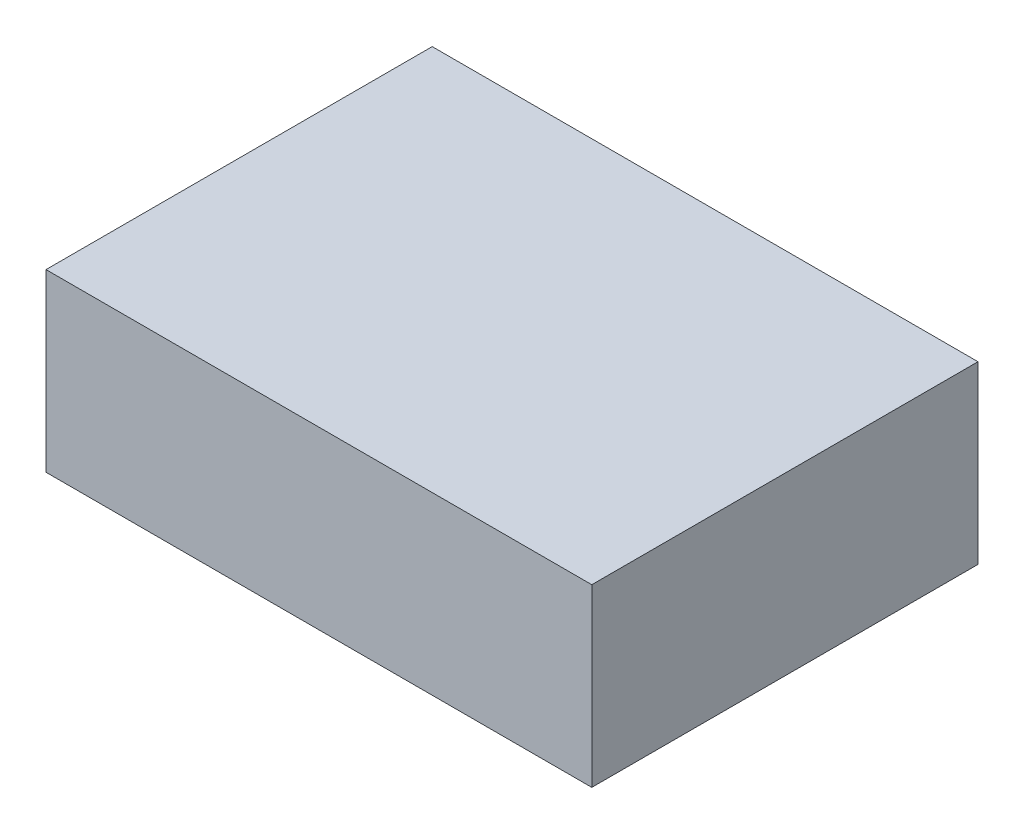
ISO-10303-21;
HEADER;
FILE_DESCRIPTION(('STEP AP214'),'2;1');
FILE_NAME('part.step','',(''),(''),'','','');
FILE_SCHEMA(('AUTOMOTIVE_DESIGN { 1 0 10303 214 1 1 1 1 }'));
ENDSEC;
DATA;
#1=APPLICATION_CONTEXT('core data for automotive mechanical design processes');
#2=APPLICATION_PROTOCOL_DEFINITION('international standard','automotive_design',2000,#1);
#3=PRODUCT_CONTEXT('',#1,'mechanical');
#4=PRODUCT('Part','Part','',(#3));
#5=PRODUCT_RELATED_PRODUCT_CATEGORY('part','',(#4));
#6=PRODUCT_DEFINITION_FORMATION('','',#4);
#7=PRODUCT_DEFINITION_CONTEXT('part definition',#1,'design');
#8=PRODUCT_DEFINITION('design','',#6,#7);
#9=PRODUCT_DEFINITION_SHAPE('','',#8);
#10=(LENGTH_UNIT() NAMED_UNIT(*) SI_UNIT(.MILLI.,.METRE.));
#11=(NAMED_UNIT(*) PLANE_ANGLE_UNIT() SI_UNIT($,.RADIAN.));
#12=(NAMED_UNIT(*) SI_UNIT($,.STERADIAN.) SOLID_ANGLE_UNIT());
#13=UNCERTAINTY_MEASURE_WITH_UNIT(LENGTH_MEASURE(1.E-05),#10,'distance_accuracy_value','');
#14=(GEOMETRIC_REPRESENTATION_CONTEXT(3) GLOBAL_UNCERTAINTY_ASSIGNED_CONTEXT((#13)) GLOBAL_UNIT_ASSIGNED_CONTEXT((#10,
#11,#12)) REPRESENTATION_CONTEXT('',''));
#15=CARTESIAN_POINT('',(0.,0.,0.));
#16=DIRECTION('',(0.,0.,1.));
#17=DIRECTION('',(1.,0.,0.));
#18=AXIS2_PLACEMENT_3D('',#15,#16,#17);
#19=CARTESIAN_POINT('',(85.5,55.,60.5));
#20=DIRECTION('',(-1.,0.,0.));
#21=DIRECTION('',(0.,0.,1.));
#22=AXIS2_PLACEMENT_3D('',#19,#20,#21);
#23=PLANE('',#22);
#24=DIRECTION('',(0.,0.,-1.));
#25=VECTOR('',#24,1.);
#26=CARTESIAN_POINT('',(85.5,0.,60.5));
#27=LINE('',#26,#25);
#28=CARTESIAN_POINT('',(85.5,0.,60.5));
#29=VERTEX_POINT('',#28);
#30=CARTESIAN_POINT('',(85.5,0.,-60.5));
#31=VERTEX_POINT('',#30);
#32=EDGE_CURVE('E107',#29,#31,#27,.T.);
#33=ORIENTED_EDGE('',*,*,#32,.T.);
#34=DIRECTION('',(0.,-1.,0.));
#35=VECTOR('',#34,1.);
#36=CARTESIAN_POINT('',(85.5,55.,-60.5));
#37=LINE('',#36,#35);
#38=CARTESIAN_POINT('',(85.5,55.,-60.5));
#39=VERTEX_POINT('',#38);
#40=EDGE_CURVE('E11',#39,#31,#37,.T.);
#41=ORIENTED_EDGE('',*,*,#40,.F.);
#42=DIRECTION('',(0.,0.,-1.));
#43=VECTOR('',#42,1.);
#44=CARTESIAN_POINT('',(85.5,55.,60.5));
#45=LINE('',#44,#43);
#46=CARTESIAN_POINT('',(85.5,55.,60.5));
#47=VERTEX_POINT('',#46);
#48=EDGE_CURVE('E91',#47,#39,#45,.T.);
#49=ORIENTED_EDGE('',*,*,#48,.F.);
#50=DIRECTION('',(0.,-1.,0.));
#51=VECTOR('',#50,1.);
#52=CARTESIAN_POINT('',(85.5,55.,60.5));
#53=LINE('',#52,#51);
#54=EDGE_CURVE('E103',#47,#29,#53,.T.);
#55=ORIENTED_EDGE('',*,*,#54,.T.);
#56=EDGE_LOOP('',(#33,#41,#49,#55));
#57=FACE_BOUND('',#56,.T.);
#58=ADVANCED_FACE('F39',(#57),#23,.F.);
#59=CARTESIAN_POINT('',(-85.5,55.,-60.5));
#60=DIRECTION('',(0.,0.,1.));
#61=DIRECTION('',(1.,0.,0.));
#62=AXIS2_PLACEMENT_3D('',#59,#60,#61);
#63=PLANE('',#62);
#64=DIRECTION('',(-1.,0.,0.));
#65=VECTOR('',#64,1.);
#66=CARTESIAN_POINT('',(-85.5,0.,-60.5));
#67=LINE('',#66,#65);
#68=CARTESIAN_POINT('',(-85.5,0.,-60.5));
#69=VERTEX_POINT('',#68);
#70=EDGE_CURVE('E96',#31,#69,#67,.T.);
#71=ORIENTED_EDGE('',*,*,#70,.T.);
#72=DIRECTION('',(0.,-1.,0.));
#73=VECTOR('',#72,1.);
#74=CARTESIAN_POINT('',(-85.5,55.,-60.5));
#75=LINE('',#74,#73);
#76=CARTESIAN_POINT('',(-85.5,55.,-60.5));
#77=VERTEX_POINT('',#76);
#78=EDGE_CURVE('E48',#77,#69,#75,.T.);
#79=ORIENTED_EDGE('',*,*,#78,.F.);
#80=DIRECTION('',(-1.,0.,0.));
#81=VECTOR('',#80,1.);
#82=CARTESIAN_POINT('',(-85.5,55.,-60.5));
#83=LINE('',#82,#81);
#84=EDGE_CURVE('E86',#39,#77,#83,.T.);
#85=ORIENTED_EDGE('',*,*,#84,.F.);
#86=ORIENTED_EDGE('',*,*,#40,.T.);
#87=EDGE_LOOP('',(#71,#79,#85,#86));
#88=FACE_BOUND('',#87,.T.);
#89=ADVANCED_FACE('F95',(#88),#63,.F.);
#90=CARTESIAN_POINT('',(-85.5,55.,60.5));
#91=DIRECTION('',(1.,0.,0.));
#92=DIRECTION('',(0.,0.,-1.));
#93=AXIS2_PLACEMENT_3D('',#90,#91,#92);
#94=PLANE('',#93);
#95=DIRECTION('',(0.,0.,1.));
#96=VECTOR('',#95,1.);
#97=CARTESIAN_POINT('',(-85.5,0.,60.5));
#98=LINE('',#97,#96);
#99=CARTESIAN_POINT('',(-85.5,0.,60.5));
#100=VERTEX_POINT('',#99);
#101=EDGE_CURVE('E73',#69,#100,#98,.T.);
#102=ORIENTED_EDGE('',*,*,#101,.T.);
#103=DIRECTION('',(0.,-1.,0.));
#104=VECTOR('',#103,1.);
#105=CARTESIAN_POINT('',(-85.5,55.,60.5));
#106=LINE('',#105,#104);
#107=CARTESIAN_POINT('',(-85.5,55.,60.5));
#108=VERTEX_POINT('',#107);
#109=EDGE_CURVE('E98',#108,#100,#106,.T.);
#110=ORIENTED_EDGE('',*,*,#109,.F.);
#111=DIRECTION('',(0.,0.,1.));
#112=VECTOR('',#111,1.);
#113=CARTESIAN_POINT('',(-85.5,55.,60.5));
#114=LINE('',#113,#112);
#115=EDGE_CURVE('E89',#77,#108,#114,.T.);
#116=ORIENTED_EDGE('',*,*,#115,.F.);
#117=ORIENTED_EDGE('',*,*,#78,.T.);
#118=EDGE_LOOP('',(#102,#110,#116,#117));
#119=FACE_BOUND('',#118,.T.);
#120=ADVANCED_FACE('F99',(#119),#94,.F.);
#121=CARTESIAN_POINT('',(-85.5,55.,60.5));
#122=DIRECTION('',(0.,0.,-1.));
#123=DIRECTION('',(-1.,0.,0.));
#124=AXIS2_PLACEMENT_3D('',#121,#122,#123);
#125=PLANE('',#124);
#126=DIRECTION('',(1.,0.,0.));
#127=VECTOR('',#126,1.);
#128=CARTESIAN_POINT('',(-85.5,0.,60.5));
#129=LINE('',#128,#127);
#130=EDGE_CURVE('E79',#100,#29,#129,.T.);
#131=ORIENTED_EDGE('',*,*,#130,.T.);
#132=ORIENTED_EDGE('',*,*,#54,.F.);
#133=DIRECTION('',(1.,0.,0.));
#134=VECTOR('',#133,1.);
#135=CARTESIAN_POINT('',(-85.5,55.,60.5));
#136=LINE('',#135,#134);
#137=EDGE_CURVE('E56',#108,#47,#136,.T.);
#138=ORIENTED_EDGE('',*,*,#137,.F.);
#139=ORIENTED_EDGE('',*,*,#109,.T.);
#140=EDGE_LOOP('',(#131,#132,#138,#139));
#141=FACE_BOUND('',#140,.T.);
#142=ADVANCED_FACE('F120',(#141),#125,.F.);
#143=CARTESIAN_POINT('',(0.,55.,0.));
#144=DIRECTION('',(0.,-1.,0.));
#145=DIRECTION('',(0.,0.,-1.));
#146=AXIS2_PLACEMENT_3D('',#143,#144,#145);
#147=PLANE('',#146);
#148=ORIENTED_EDGE('',*,*,#48,.T.);
#149=ORIENTED_EDGE('',*,*,#84,.T.);
#150=ORIENTED_EDGE('',*,*,#115,.T.);
#151=ORIENTED_EDGE('',*,*,#137,.T.);
#152=EDGE_LOOP('',(#148,#149,#150,#151));
#153=FACE_BOUND('',#152,.T.);
#154=ADVANCED_FACE('F87',(#153),#147,.F.);
#155=CARTESIAN_POINT('',(0.,0.,0.));
#156=DIRECTION('',(0.,-1.,0.));
#157=DIRECTION('',(0.,0.,-1.));
#158=AXIS2_PLACEMENT_3D('',#155,#156,#157);
#159=PLANE('',#158);
#160=ORIENTED_EDGE('',*,*,#32,.F.);
#161=ORIENTED_EDGE('',*,*,#130,.F.);
#162=ORIENTED_EDGE('',*,*,#101,.F.);
#163=ORIENTED_EDGE('',*,*,#70,.F.);
#164=EDGE_LOOP('',(#160,#161,#162,#163));
#165=FACE_BOUND('',#164,.T.);
#166=ADVANCED_FACE('F123',(#165),#159,.T.);
#167=CLOSED_SHELL('',(#58,#89,#120,#142,#154,#166));
#168=MANIFOLD_SOLID_BREP('B2',#167);
#169=ADVANCED_BREP_SHAPE_REPRESENTATION('',(#18,#168),#14);
#170=SHAPE_DEFINITION_REPRESENTATION(#9,#169);
ENDSEC;
END-ISO-10303-21;
